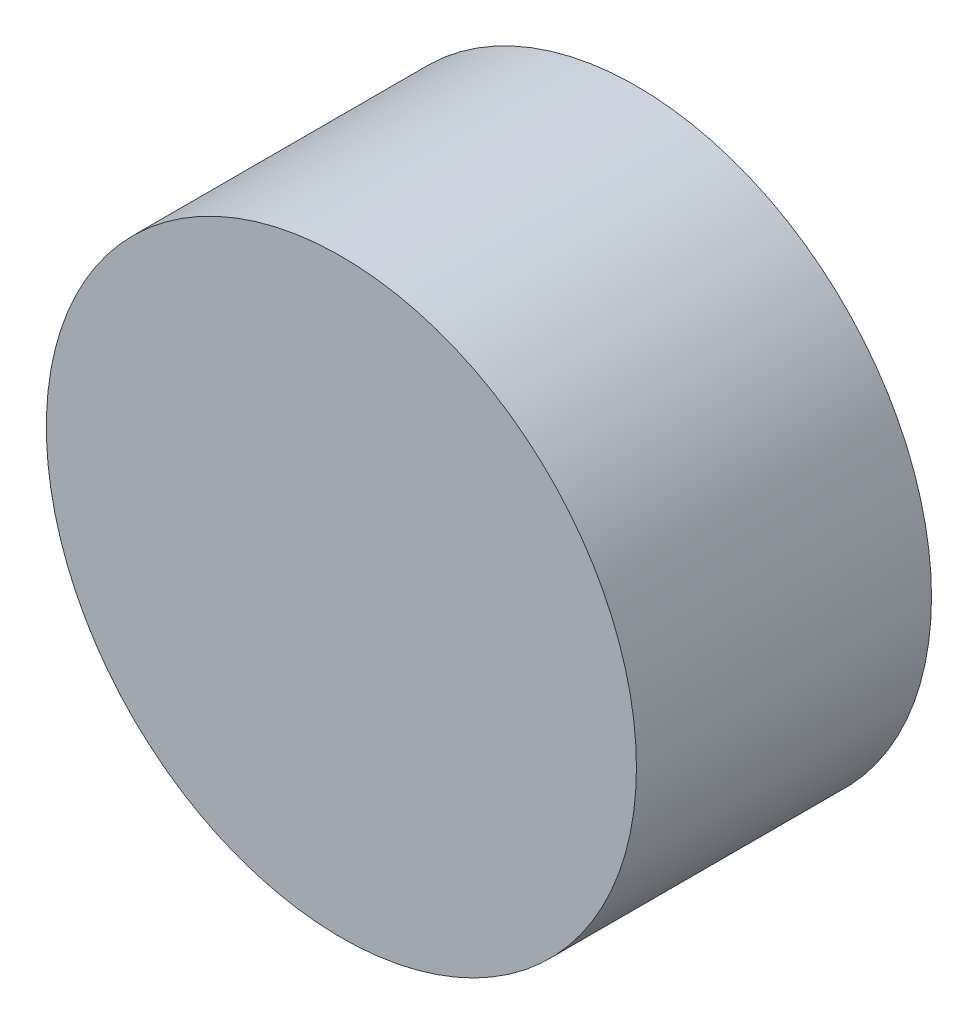
ISO-10303-21;
HEADER;
FILE_DESCRIPTION(('STEP AP214'),'2;1');
FILE_NAME('part.step','',(''),(''),'','','');
FILE_SCHEMA(('AUTOMOTIVE_DESIGN { 1 0 10303 214 1 1 1 1 }'));
ENDSEC;
DATA;
#1=APPLICATION_CONTEXT('core data for automotive mechanical design processes');
#2=APPLICATION_PROTOCOL_DEFINITION('international standard','automotive_design',2000,#1);
#3=PRODUCT_CONTEXT('',#1,'mechanical');
#4=PRODUCT('Part','Part','',(#3));
#5=PRODUCT_RELATED_PRODUCT_CATEGORY('part','',(#4));
#6=PRODUCT_DEFINITION_FORMATION('','',#4);
#7=PRODUCT_DEFINITION_CONTEXT('part definition',#1,'design');
#8=PRODUCT_DEFINITION('design','',#6,#7);
#9=PRODUCT_DEFINITION_SHAPE('','',#8);
#10=(LENGTH_UNIT() NAMED_UNIT(*) SI_UNIT(.MILLI.,.METRE.));
#11=(NAMED_UNIT(*) PLANE_ANGLE_UNIT() SI_UNIT($,.RADIAN.));
#12=(NAMED_UNIT(*) SI_UNIT($,.STERADIAN.) SOLID_ANGLE_UNIT());
#13=UNCERTAINTY_MEASURE_WITH_UNIT(LENGTH_MEASURE(1.E-05),#10,'distance_accuracy_value','');
#14=(GEOMETRIC_REPRESENTATION_CONTEXT(3) GLOBAL_UNCERTAINTY_ASSIGNED_CONTEXT((#13)) GLOBAL_UNIT_ASSIGNED_CONTEXT((#10,
#11,#12)) REPRESENTATION_CONTEXT('',''));
#15=CARTESIAN_POINT('',(0.,0.,0.));
#16=DIRECTION('',(0.,0.,1.));
#17=DIRECTION('',(1.,0.,0.));
#18=AXIS2_PLACEMENT_3D('',#15,#16,#17);
#19=CARTESIAN_POINT('',(0.,0.,4.));
#20=DIRECTION('',(0.,0.,-1.));
#21=DIRECTION('',(-1.,0.,0.));
#22=AXIS2_PLACEMENT_3D('',#19,#20,#21);
#23=CYLINDRICAL_SURFACE('',#22,4.);
#24=CARTESIAN_POINT('',(0.,0.,4.));
#25=DIRECTION('',(0.,0.,1.));
#26=DIRECTION('',(1.,0.,0.));
#27=AXIS2_PLACEMENT_3D('',#24,#25,#26);
#28=CIRCLE('',#27,4.);
#29=CARTESIAN_POINT('',(4.,0.,4.));
#30=VERTEX_POINT('',#29);
#31=EDGE_CURVE('E10',#30,#30,#28,.T.);
#32=ORIENTED_EDGE('',*,*,#31,.F.);
#33=EDGE_LOOP('',(#32));
#34=FACE_BOUND('',#33,.T.);
#35=CARTESIAN_POINT('',(0.,0.,0.));
#36=DIRECTION('',(0.,0.,1.));
#37=DIRECTION('',(1.,0.,0.));
#38=AXIS2_PLACEMENT_3D('',#35,#36,#37);
#39=CIRCLE('',#38,4.);
#40=CARTESIAN_POINT('',(4.,0.,0.));
#41=VERTEX_POINT('',#40);
#42=EDGE_CURVE('E40',#41,#41,#39,.T.);
#43=ORIENTED_EDGE('',*,*,#42,.T.);
#44=EDGE_LOOP('',(#43));
#45=FACE_BOUND('',#44,.T.);
#46=ADVANCED_FACE('F37',(#34,#45),#23,.T.);
#47=CARTESIAN_POINT('',(0.,0.,4.));
#48=DIRECTION('',(0.,0.,1.));
#49=DIRECTION('',(1.,0.,0.));
#50=AXIS2_PLACEMENT_3D('',#47,#48,#49);
#51=PLANE('',#50);
#52=ORIENTED_EDGE('',*,*,#31,.T.);
#53=EDGE_LOOP('',(#52));
#54=FACE_BOUND('',#53,.T.);
#55=ADVANCED_FACE('F52',(#54),#51,.T.);
#56=CARTESIAN_POINT('',(0.,0.,0.));
#57=DIRECTION('',(0.,0.,1.));
#58=DIRECTION('',(1.,0.,0.));
#59=AXIS2_PLACEMENT_3D('',#56,#57,#58);
#60=PLANE('',#59);
#61=ORIENTED_EDGE('',*,*,#42,.F.);
#62=EDGE_LOOP('',(#61));
#63=FACE_BOUND('',#62,.T.);
#64=ADVANCED_FACE('F50',(#63),#60,.F.);
#65=CLOSED_SHELL('',(#46,#55,#64));
#66=MANIFOLD_SOLID_BREP('B2',#65);
#67=ADVANCED_BREP_SHAPE_REPRESENTATION('',(#18,#66),#14);
#68=SHAPE_DEFINITION_REPRESENTATION(#9,#67);
ENDSEC;
END-ISO-10303-21;
